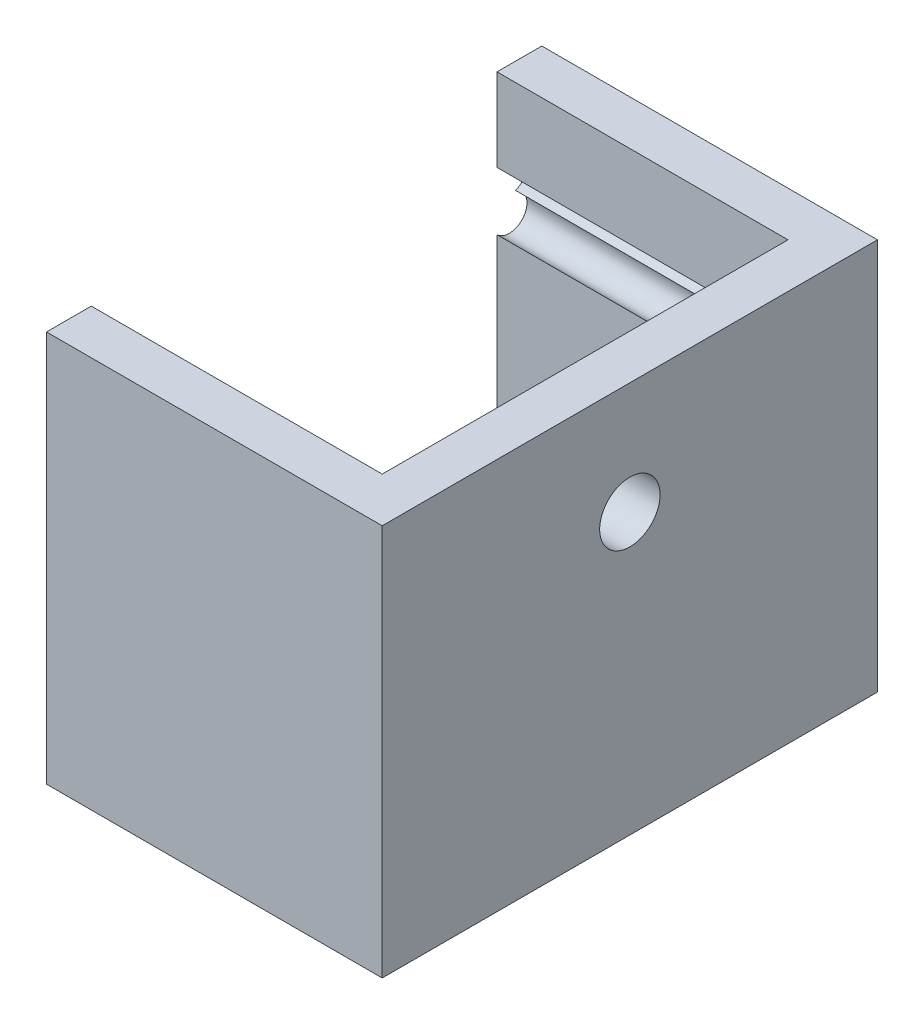
ISO-10303-21;
HEADER;
FILE_DESCRIPTION(('STEP AP214'),'2;1');
FILE_NAME('part.step','',(''),(''),'','','');
FILE_SCHEMA(('AUTOMOTIVE_DESIGN { 1 0 10303 214 1 1 1 1 }'));
ENDSEC;
DATA;
#1=APPLICATION_CONTEXT('core data for automotive mechanical design processes');
#2=APPLICATION_PROTOCOL_DEFINITION('international standard','automotive_design',2000,#1);
#3=PRODUCT_CONTEXT('',#1,'mechanical');
#4=PRODUCT('Part','Part','',(#3));
#5=PRODUCT_RELATED_PRODUCT_CATEGORY('part','',(#4));
#6=PRODUCT_DEFINITION_FORMATION('','',#4);
#7=PRODUCT_DEFINITION_CONTEXT('part definition',#1,'design');
#8=PRODUCT_DEFINITION('design','',#6,#7);
#9=PRODUCT_DEFINITION_SHAPE('','',#8);
#10=(LENGTH_UNIT() NAMED_UNIT(*) SI_UNIT(.MILLI.,.METRE.));
#11=(NAMED_UNIT(*) PLANE_ANGLE_UNIT() SI_UNIT($,.RADIAN.));
#12=(NAMED_UNIT(*) SI_UNIT($,.STERADIAN.) SOLID_ANGLE_UNIT());
#13=UNCERTAINTY_MEASURE_WITH_UNIT(LENGTH_MEASURE(1.E-05),#10,'distance_accuracy_value','');
#14=(GEOMETRIC_REPRESENTATION_CONTEXT(3) GLOBAL_UNCERTAINTY_ASSIGNED_CONTEXT((#13)) GLOBAL_UNIT_ASSIGNED_CONTEXT((#10,
#11,#12)) REPRESENTATION_CONTEXT('',''));
#15=CARTESIAN_POINT('',(0.,0.,0.));
#16=DIRECTION('',(0.,0.,1.));
#17=DIRECTION('',(1.,0.,0.));
#18=AXIS2_PLACEMENT_3D('',#15,#16,#17);
#19=CARTESIAN_POINT('',(-30.,4.,4.));
#20=DIRECTION('',(0.,0.,-1.));
#21=DIRECTION('',(-1.,0.,0.));
#22=AXIS2_PLACEMENT_3D('',#19,#20,#21);
#23=PLANE('',#22);
#24=DIRECTION('',(0.,1.,0.));
#25=VECTOR('',#24,1.);
#26=CARTESIAN_POINT('',(-30.,4.,4.));
#27=LINE('',#26,#25);
#28=CARTESIAN_POINT('',(-30.,27.6022200317595,4.));
#29=VERTEX_POINT('',#28);
#30=CARTESIAN_POINT('',(-30.,35.,4.));
#31=VERTEX_POINT('',#30);
#32=EDGE_CURVE('E166',#29,#31,#27,.T.);
#33=ORIENTED_EDGE('',*,*,#32,.F.);
#34=DIRECTION('',(-1.,0.,0.));
#35=VECTOR('',#34,1.);
#36=CARTESIAN_POINT('',(2.66075258510628,27.6022200317595,4.));
#37=LINE('',#36,#35);
#38=CARTESIAN_POINT('',(-4.00000000000001,27.6022200317595,4.));
#39=VERTEX_POINT('',#38);
#40=EDGE_CURVE('E154',#39,#29,#37,.T.);
#41=ORIENTED_EDGE('',*,*,#40,.F.);
#42=DIRECTION('',(0.,1.,0.));
#43=VECTOR('',#42,1.);
#44=CARTESIAN_POINT('',(-4.00000000000001,4.,4.));
#45=LINE('',#44,#43);
#46=CARTESIAN_POINT('',(-4.00000000000001,35.,4.));
#47=VERTEX_POINT('',#46);
#48=EDGE_CURVE('E164',#39,#47,#45,.T.);
#49=ORIENTED_EDGE('',*,*,#48,.T.);
#50=DIRECTION('',(-1.,0.,0.));
#51=VECTOR('',#50,1.);
#52=CARTESIAN_POINT('',(-30.,35.,4.));
#53=LINE('',#52,#51);
#54=EDGE_CURVE('E309',#47,#31,#53,.T.);
#55=ORIENTED_EDGE('',*,*,#54,.T.);
#56=EDGE_LOOP('',(#33,#41,#49,#55));
#57=FACE_BOUND('',#56,.T.);
#58=ADVANCED_FACE('F45',(#57),#23,.F.);
#59=CARTESIAN_POINT('',(-30.,4.,40.26));
#60=DIRECTION('',(0.,0.,1.));
#61=DIRECTION('',(1.,0.,0.));
#62=AXIS2_PLACEMENT_3D('',#59,#60,#61);
#63=PLANE('',#62);
#64=DIRECTION('',(0.,1.,0.));
#65=VECTOR('',#64,1.);
#66=CARTESIAN_POINT('',(-30.,4.,40.26));
#67=LINE('',#66,#65);
#68=CARTESIAN_POINT('',(-30.,4.,40.26));
#69=VERTEX_POINT('',#68);
#70=CARTESIAN_POINT('',(-30.,22.3977799682404,40.26));
#71=VERTEX_POINT('',#70);
#72=EDGE_CURVE('E188',#69,#71,#67,.T.);
#73=ORIENTED_EDGE('',*,*,#72,.T.);
#74=DIRECTION('',(-1.,0.,0.));
#75=VECTOR('',#74,1.);
#76=CARTESIAN_POINT('',(2.66075258510628,22.3977799682404,40.26));
#77=LINE('',#76,#75);
#78=CARTESIAN_POINT('',(-4.00000000000001,22.3977799682404,40.26));
#79=VERTEX_POINT('',#78);
#80=EDGE_CURVE('E320',#79,#71,#77,.T.);
#81=ORIENTED_EDGE('',*,*,#80,.F.);
#82=DIRECTION('',(0.,1.,0.));
#83=VECTOR('',#82,1.);
#84=CARTESIAN_POINT('',(-4.,4.,40.26));
#85=LINE('',#84,#83);
#86=CARTESIAN_POINT('',(-4.,4.,40.26));
#87=VERTEX_POINT('',#86);
#88=EDGE_CURVE('E176',#87,#79,#85,.T.);
#89=ORIENTED_EDGE('',*,*,#88,.F.);
#90=DIRECTION('',(1.,0.,0.));
#91=VECTOR('',#90,1.);
#92=CARTESIAN_POINT('',(-30.,4.,40.26));
#93=LINE('',#92,#91);
#94=EDGE_CURVE('E344',#69,#87,#93,.T.);
#95=ORIENTED_EDGE('',*,*,#94,.F.);
#96=EDGE_LOOP('',(#73,#81,#89,#95));
#97=FACE_BOUND('',#96,.T.);
#98=ADVANCED_FACE('F273',(#97),#63,.F.);
#99=CARTESIAN_POINT('',(0.,0.,44.26));
#100=DIRECTION('',(-1.,0.,0.));
#101=DIRECTION('',(0.,0.,1.));
#102=AXIS2_PLACEMENT_3D('',#99,#100,#101);
#103=PLANE('',#102);
#104=CARTESIAN_POINT('',(0.,25.,22.13));
#105=DIRECTION('',(-1.,0.,0.));
#106=DIRECTION('',(0.,0.,1.));
#107=AXIS2_PLACEMENT_3D('',#104,#105,#106);
#108=CIRCLE('',#107,2.7);
#109=CARTESIAN_POINT('',(0.,25.,24.83));
#110=VERTEX_POINT('',#109);
#111=EDGE_CURVE('E239',#110,#110,#108,.T.);
#112=ORIENTED_EDGE('',*,*,#111,.T.);
#113=EDGE_LOOP('',(#112));
#114=FACE_BOUND('',#113,.T.);
#115=DIRECTION('',(0.,1.,0.));
#116=VECTOR('',#115,1.);
#117=CARTESIAN_POINT('',(0.,0.,0.));
#118=LINE('',#117,#116);
#119=CARTESIAN_POINT('',(0.,0.,0.));
#120=VERTEX_POINT('',#119);
#121=CARTESIAN_POINT('',(0.,35.,0.));
#122=VERTEX_POINT('',#121);
#123=EDGE_CURVE('E181',#120,#122,#118,.T.);
#124=ORIENTED_EDGE('',*,*,#123,.T.);
#125=DIRECTION('',(0.,0.,-1.));
#126=VECTOR('',#125,1.);
#127=CARTESIAN_POINT('',(0.,35.,44.26));
#128=LINE('',#127,#126);
#129=CARTESIAN_POINT('',(0.,35.,44.26));
#130=VERTEX_POINT('',#129);
#131=EDGE_CURVE('E11',#130,#122,#128,.T.);
#132=ORIENTED_EDGE('',*,*,#131,.F.);
#133=DIRECTION('',(0.,1.,0.));
#134=VECTOR('',#133,1.);
#135=CARTESIAN_POINT('',(0.,0.,44.26));
#136=LINE('',#135,#134);
#137=CARTESIAN_POINT('',(0.,0.,44.26));
#138=VERTEX_POINT('',#137);
#139=EDGE_CURVE('E197',#138,#130,#136,.T.);
#140=ORIENTED_EDGE('',*,*,#139,.F.);
#141=DIRECTION('',(0.,0.,-1.));
#142=VECTOR('',#141,1.);
#143=CARTESIAN_POINT('',(0.,0.,44.26));
#144=LINE('',#143,#142);
#145=EDGE_CURVE('E211',#138,#120,#144,.T.);
#146=ORIENTED_EDGE('',*,*,#145,.T.);
#147=EDGE_LOOP('',(#124,#132,#140,#146));
#148=FACE_BOUND('',#147,.T.);
#149=ADVANCED_FACE('F47',(#114,#148),#103,.F.);
#150=CARTESIAN_POINT('',(0.,35.,44.26));
#151=DIRECTION('',(0.,-1.,0.));
#152=DIRECTION('',(0.,0.,-1.));
#153=AXIS2_PLACEMENT_3D('',#150,#151,#152);
#154=PLANE('',#153);
#155=DIRECTION('',(0.,0.,-1.));
#156=VECTOR('',#155,1.);
#157=CARTESIAN_POINT('',(-30.,35.,44.26));
#158=LINE('',#157,#156);
#159=CARTESIAN_POINT('',(-30.,35.,0.));
#160=VERTEX_POINT('',#159);
#161=EDGE_CURVE('E231',#31,#160,#158,.T.);
#162=ORIENTED_EDGE('',*,*,#161,.F.);
#163=ORIENTED_EDGE('',*,*,#54,.F.);
#164=DIRECTION('',(0.,0.,-1.));
#165=VECTOR('',#164,1.);
#166=CARTESIAN_POINT('',(-4.00000000000001,35.,4.));
#167=LINE('',#166,#165);
#168=CARTESIAN_POINT('',(-4.00000000000001,35.,40.26));
#169=VERTEX_POINT('',#168);
#170=EDGE_CURVE('E172',#169,#47,#167,.T.);
#171=ORIENTED_EDGE('',*,*,#170,.F.);
#172=DIRECTION('',(1.,0.,0.));
#173=VECTOR('',#172,1.);
#174=CARTESIAN_POINT('',(-30.,35.,40.26));
#175=LINE('',#174,#173);
#176=CARTESIAN_POINT('',(-30.,35.,40.26));
#177=VERTEX_POINT('',#176);
#178=EDGE_CURVE('E351',#177,#169,#175,.T.);
#179=ORIENTED_EDGE('',*,*,#178,.F.);
#180=CARTESIAN_POINT('',(-30.,35.,44.26));
#181=VERTEX_POINT('',#180);
#182=EDGE_CURVE('E55',#181,#177,#158,.T.);
#183=ORIENTED_EDGE('',*,*,#182,.F.);
#184=DIRECTION('',(-1.,0.,0.));
#185=VECTOR('',#184,1.);
#186=CARTESIAN_POINT('',(0.,35.,44.26));
#187=LINE('',#186,#185);
#188=EDGE_CURVE('E201',#130,#181,#187,.T.);
#189=ORIENTED_EDGE('',*,*,#188,.F.);
#190=ORIENTED_EDGE('',*,*,#131,.T.);
#191=DIRECTION('',(-1.,0.,0.));
#192=VECTOR('',#191,1.);
#193=CARTESIAN_POINT('',(0.,35.,0.));
#194=LINE('',#193,#192);
#195=EDGE_CURVE('E215',#122,#160,#194,.T.);
#196=ORIENTED_EDGE('',*,*,#195,.T.);
#197=EDGE_LOOP('',(#162,#163,#171,#179,#183,#189,#190,#196));
#198=FACE_BOUND('',#197,.T.);
#199=ADVANCED_FACE('F371',(#198),#154,.F.);
#200=CARTESIAN_POINT('',(-30.,0.,44.26));
#201=DIRECTION('',(1.,0.,0.));
#202=DIRECTION('',(0.,0.,-1.));
#203=AXIS2_PLACEMENT_3D('',#200,#201,#202);
#204=PLANE('',#203);
#205=CARTESIAN_POINT('',(-30.,23.525,2.9));
#206=DIRECTION('',(-1.,0.,0.));
#207=DIRECTION('',(0.,0.,1.));
#208=AXIS2_PLACEMENT_3D('',#205,#206,#207);
#209=CIRCLE('',#208,1.575);
#210=CARTESIAN_POINT('',(-30.,25.,2.34773194914063));
#211=VERTEX_POINT('',#210);
#212=CARTESIAN_POINT('',(-30.,22.3977799682404,4.));
#213=VERTEX_POINT('',#212);
#214=EDGE_CURVE('E313',#211,#213,#209,.T.);
#215=ORIENTED_EDGE('',*,*,#214,.F.);
#216=CARTESIAN_POINT('',(-30.,26.475,2.9));
#217=DIRECTION('',(-1.,0.,0.));
#218=DIRECTION('',(0.,0.,1.));
#219=AXIS2_PLACEMENT_3D('',#216,#217,#218);
#220=CIRCLE('',#219,1.575);
#221=EDGE_CURVE('E168',#29,#211,#220,.T.);
#222=ORIENTED_EDGE('',*,*,#221,.F.);
#223=ORIENTED_EDGE('',*,*,#32,.T.);
#224=ORIENTED_EDGE('',*,*,#161,.T.);
#225=DIRECTION('',(0.,-1.,0.));
#226=VECTOR('',#225,1.);
#227=CARTESIAN_POINT('',(-30.,0.,0.));
#228=LINE('',#227,#226);
#229=CARTESIAN_POINT('',(-30.,0.,0.));
#230=VERTEX_POINT('',#229);
#231=EDGE_CURVE('E219',#160,#230,#228,.T.);
#232=ORIENTED_EDGE('',*,*,#231,.T.);
#233=DIRECTION('',(0.,0.,-1.));
#234=VECTOR('',#233,1.);
#235=CARTESIAN_POINT('',(-30.,0.,44.26));
#236=LINE('',#235,#234);
#237=CARTESIAN_POINT('',(-30.,0.,44.26));
#238=VERTEX_POINT('',#237);
#239=EDGE_CURVE('E227',#238,#230,#236,.T.);
#240=ORIENTED_EDGE('',*,*,#239,.F.);
#241=DIRECTION('',(0.,-1.,0.));
#242=VECTOR('',#241,1.);
#243=CARTESIAN_POINT('',(-30.,0.,44.26));
#244=LINE('',#243,#242);
#245=EDGE_CURVE('E205',#181,#238,#244,.T.);
#246=ORIENTED_EDGE('',*,*,#245,.F.);
#247=ORIENTED_EDGE('',*,*,#182,.T.);
#248=CARTESIAN_POINT('',(-30.,27.6022200317596,40.26));
#249=VERTEX_POINT('',#248);
#250=EDGE_CURVE('E192',#249,#177,#67,.T.);
#251=ORIENTED_EDGE('',*,*,#250,.F.);
#252=CARTESIAN_POINT('',(-30.,26.475,41.36));
#253=DIRECTION('',(-1.,0.,0.));
#254=DIRECTION('',(0.,0.,-1.));
#255=AXIS2_PLACEMENT_3D('',#252,#253,#254);
#256=CIRCLE('',#255,1.575);
#257=CARTESIAN_POINT('',(-30.,25.,41.9122680508594));
#258=VERTEX_POINT('',#257);
#259=EDGE_CURVE('E71',#258,#249,#256,.T.);
#260=ORIENTED_EDGE('',*,*,#259,.F.);
#261=CARTESIAN_POINT('',(-30.,23.525,41.36));
#262=DIRECTION('',(-1.,0.,0.));
#263=DIRECTION('',(0.,0.,-1.));
#264=AXIS2_PLACEMENT_3D('',#261,#262,#263);
#265=CIRCLE('',#264,1.575);
#266=EDGE_CURVE('E323',#71,#258,#265,.T.);
#267=ORIENTED_EDGE('',*,*,#266,.F.);
#268=ORIENTED_EDGE('',*,*,#72,.F.);
#269=DIRECTION('',(0.,0.,1.));
#270=VECTOR('',#269,1.);
#271=CARTESIAN_POINT('',(-30.,4.,40.26));
#272=LINE('',#271,#270);
#273=CARTESIAN_POINT('',(-30.,4.,4.));
#274=VERTEX_POINT('',#273);
#275=EDGE_CURVE('E340',#274,#69,#272,.T.);
#276=ORIENTED_EDGE('',*,*,#275,.F.);
#277=EDGE_CURVE('E193',#274,#213,#27,.T.);
#278=ORIENTED_EDGE('',*,*,#277,.T.);
#279=EDGE_LOOP('',(#215,#222,#223,#224,#232,#240,#246,#247,#251,#260,#267,#268,#276,#278));
#280=FACE_BOUND('',#279,.T.);
#281=ADVANCED_FACE('F364',(#280),#204,.F.);
#282=CARTESIAN_POINT('',(0.,0.,44.26));
#283=DIRECTION('',(0.,1.,0.));
#284=DIRECTION('',(-1.,0.,0.));
#285=AXIS2_PLACEMENT_3D('',#282,#283,#284);
#286=PLANE('',#285);
#287=CARTESIAN_POINT('',(-24.,0.,14.26));
#288=DIRECTION('',(0.,1.,0.));
#289=DIRECTION('',(1.,0.,0.));
#290=AXIS2_PLACEMENT_3D('',#287,#288,#289);
#291=CIRCLE('',#290,1.65);
#292=CARTESIAN_POINT('',(-22.35,0.,14.26));
#293=VERTEX_POINT('',#292);
#294=EDGE_CURVE('E384',#293,#293,#291,.T.);
#295=ORIENTED_EDGE('',*,*,#294,.T.);
#296=EDGE_LOOP('',(#295));
#297=FACE_BOUND('',#296,.T.);
#298=CARTESIAN_POINT('',(-12.,0.,14.26));
#299=DIRECTION('',(0.,1.,0.));
#300=DIRECTION('',(1.,0.,0.));
#301=AXIS2_PLACEMENT_3D('',#298,#299,#300);
#302=CIRCLE('',#301,1.65);
#303=CARTESIAN_POINT('',(-10.35,0.,14.26));
#304=VERTEX_POINT('',#303);
#305=EDGE_CURVE('E388',#304,#304,#302,.T.);
#306=ORIENTED_EDGE('',*,*,#305,.T.);
#307=EDGE_LOOP('',(#306));
#308=FACE_BOUND('',#307,.T.);
#309=CARTESIAN_POINT('',(-12.,0.,34.26));
#310=DIRECTION('',(0.,1.,0.));
#311=DIRECTION('',(-1.,0.,0.));
#312=AXIS2_PLACEMENT_3D('',#309,#310,#311);
#313=CIRCLE('',#312,1.65);
#314=CARTESIAN_POINT('',(-13.65,0.,34.26));
#315=VERTEX_POINT('',#314);
#316=EDGE_CURVE('E383',#315,#315,#313,.T.);
#317=ORIENTED_EDGE('',*,*,#316,.T.);
#318=EDGE_LOOP('',(#317));
#319=FACE_BOUND('',#318,.T.);
#320=CARTESIAN_POINT('',(-24.,0.,34.26));
#321=DIRECTION('',(0.,1.,0.));
#322=DIRECTION('',(-1.,0.,0.));
#323=AXIS2_PLACEMENT_3D('',#320,#321,#322);
#324=CIRCLE('',#323,1.65);
#325=CARTESIAN_POINT('',(-25.65,0.,34.26));
#326=VERTEX_POINT('',#325);
#327=EDGE_CURVE('E245',#326,#326,#324,.T.);
#328=ORIENTED_EDGE('',*,*,#327,.T.);
#329=EDGE_LOOP('',(#328));
#330=FACE_BOUND('',#329,.T.);
#331=DIRECTION('',(1.,0.,0.));
#332=VECTOR('',#331,1.);
#333=CARTESIAN_POINT('',(0.,0.,0.));
#334=LINE('',#333,#332);
#335=EDGE_CURVE('E202',#230,#120,#334,.T.);
#336=ORIENTED_EDGE('',*,*,#335,.T.);
#337=ORIENTED_EDGE('',*,*,#145,.F.);
#338=DIRECTION('',(1.,0.,0.));
#339=VECTOR('',#338,1.);
#340=CARTESIAN_POINT('',(0.,0.,44.26));
#341=LINE('',#340,#339);
#342=EDGE_CURVE('E208',#238,#138,#341,.T.);
#343=ORIENTED_EDGE('',*,*,#342,.F.);
#344=ORIENTED_EDGE('',*,*,#239,.T.);
#345=EDGE_LOOP('',(#336,#337,#343,#344));
#346=FACE_BOUND('',#345,.T.);
#347=ADVANCED_FACE('F396',(#297,#308,#319,#330,#346),#286,.F.);
#348=CARTESIAN_POINT('',(0.,0.,44.26));
#349=DIRECTION('',(0.,0.,1.));
#350=DIRECTION('',(1.,0.,0.));
#351=AXIS2_PLACEMENT_3D('',#348,#349,#350);
#352=PLANE('',#351);
#353=ORIENTED_EDGE('',*,*,#139,.T.);
#354=ORIENTED_EDGE('',*,*,#188,.T.);
#355=ORIENTED_EDGE('',*,*,#245,.T.);
#356=ORIENTED_EDGE('',*,*,#342,.T.);
#357=EDGE_LOOP('',(#353,#354,#355,#356));
#358=FACE_BOUND('',#357,.T.);
#359=ADVANCED_FACE('F295',(#358),#352,.T.);
#360=CARTESIAN_POINT('',(0.,0.,0.));
#361=DIRECTION('',(0.,0.,1.));
#362=DIRECTION('',(1.,0.,0.));
#363=AXIS2_PLACEMENT_3D('',#360,#361,#362);
#364=PLANE('',#363);
#365=ORIENTED_EDGE('',*,*,#123,.F.);
#366=ORIENTED_EDGE('',*,*,#335,.F.);
#367=ORIENTED_EDGE('',*,*,#231,.F.);
#368=ORIENTED_EDGE('',*,*,#195,.F.);
#369=EDGE_LOOP('',(#365,#366,#367,#368));
#370=FACE_BOUND('',#369,.T.);
#371=ADVANCED_FACE('F285',(#370),#364,.F.);
#372=CARTESIAN_POINT('',(-4.00000000000001,4.,4.));
#373=VERTEX_POINT('',#372);
#374=CARTESIAN_POINT('',(-4.00000000000001,22.3977799682404,4.));
#375=VERTEX_POINT('',#374);
#376=EDGE_CURVE('E175',#373,#375,#45,.T.);
#377=ORIENTED_EDGE('',*,*,#376,.T.);
#378=DIRECTION('',(-1.,0.,0.));
#379=VECTOR('',#378,1.);
#380=CARTESIAN_POINT('',(2.66075258510628,22.3977799682404,4.));
#381=LINE('',#380,#379);
#382=EDGE_CURVE('E63',#375,#213,#381,.T.);
#383=ORIENTED_EDGE('',*,*,#382,.T.);
#384=ORIENTED_EDGE('',*,*,#277,.F.);
#385=DIRECTION('',(-1.,0.,0.));
#386=VECTOR('',#385,1.);
#387=CARTESIAN_POINT('',(-30.,4.,4.));
#388=LINE('',#387,#386);
#389=EDGE_CURVE('E300',#373,#274,#388,.T.);
#390=ORIENTED_EDGE('',*,*,#389,.F.);
#391=EDGE_LOOP('',(#377,#383,#384,#390));
#392=FACE_BOUND('',#391,.T.);
#393=ADVANCED_FACE('F275',(#392),#23,.F.);
#394=CARTESIAN_POINT('',(-4.00000000000001,4.,4.));
#395=DIRECTION('',(1.,0.,0.));
#396=DIRECTION('',(0.,1.,0.));
#397=AXIS2_PLACEMENT_3D('',#394,#395,#396);
#398=PLANE('',#397);
#399=CARTESIAN_POINT('',(-4.,25.,22.13));
#400=DIRECTION('',(1.,0.,0.));
#401=DIRECTION('',(0.,1.,0.));
#402=AXIS2_PLACEMENT_3D('',#399,#400,#401);
#403=CIRCLE('',#402,2.7);
#404=CARTESIAN_POINT('',(-4.,27.7,22.13));
#405=VERTEX_POINT('',#404);
#406=EDGE_CURVE('E235',#405,#405,#403,.T.);
#407=ORIENTED_EDGE('',*,*,#406,.T.);
#408=EDGE_LOOP('',(#407));
#409=FACE_BOUND('',#408,.T.);
#410=ORIENTED_EDGE('',*,*,#170,.T.);
#411=ORIENTED_EDGE('',*,*,#48,.F.);
#412=CARTESIAN_POINT('',(-4.00000000000001,26.475,2.9));
#413=DIRECTION('',(1.,0.,0.));
#414=DIRECTION('',(0.,1.,0.));
#415=AXIS2_PLACEMENT_3D('',#412,#413,#414);
#416=CIRCLE('',#415,1.575);
#417=CARTESIAN_POINT('',(-4.00000000000001,25.,2.34773194914063));
#418=VERTEX_POINT('',#417);
#419=EDGE_CURVE('E150',#39,#418,#416,.F.);
#420=ORIENTED_EDGE('',*,*,#419,.T.);
#421=CARTESIAN_POINT('',(-4.00000000000001,23.525,2.9));
#422=DIRECTION('',(1.,0.,0.));
#423=DIRECTION('',(0.,1.,0.));
#424=AXIS2_PLACEMENT_3D('',#421,#422,#423);
#425=CIRCLE('',#424,1.575);
#426=EDGE_CURVE('E304',#418,#375,#425,.F.);
#427=ORIENTED_EDGE('',*,*,#426,.T.);
#428=ORIENTED_EDGE('',*,*,#376,.F.);
#429=DIRECTION('',(0.,0.,-1.));
#430=VECTOR('',#429,1.);
#431=CARTESIAN_POINT('',(-4.00000000000001,4.,4.));
#432=LINE('',#431,#430);
#433=EDGE_CURVE('E303',#87,#373,#432,.T.);
#434=ORIENTED_EDGE('',*,*,#433,.F.);
#435=ORIENTED_EDGE('',*,*,#88,.T.);
#436=CARTESIAN_POINT('',(-4.,23.525,41.36));
#437=DIRECTION('',(1.,0.,0.));
#438=DIRECTION('',(0.,1.,0.));
#439=AXIS2_PLACEMENT_3D('',#436,#437,#438);
#440=CIRCLE('',#439,1.575);
#441=CARTESIAN_POINT('',(-4.,25.,41.9122680508594));
#442=VERTEX_POINT('',#441);
#443=EDGE_CURVE('E324',#79,#442,#440,.F.);
#444=ORIENTED_EDGE('',*,*,#443,.T.);
#445=CARTESIAN_POINT('',(-4.,26.475,41.36));
#446=DIRECTION('',(1.,0.,0.));
#447=DIRECTION('',(0.,1.,0.));
#448=AXIS2_PLACEMENT_3D('',#445,#446,#447);
#449=CIRCLE('',#448,1.575);
#450=CARTESIAN_POINT('',(-4.00000000000001,27.6022200317596,40.26));
#451=VERTEX_POINT('',#450);
#452=EDGE_CURVE('E319',#442,#451,#449,.F.);
#453=ORIENTED_EDGE('',*,*,#452,.T.);
#454=EDGE_CURVE('E183',#451,#169,#85,.T.);
#455=ORIENTED_EDGE('',*,*,#454,.T.);
#456=EDGE_LOOP('',(#410,#411,#420,#427,#428,#434,#435,#444,#453,#455));
#457=FACE_BOUND('',#456,.T.);
#458=ADVANCED_FACE('F170',(#409,#457),#398,.F.);
#459=ORIENTED_EDGE('',*,*,#454,.F.);
#460=DIRECTION('',(-1.,0.,0.));
#461=VECTOR('',#460,1.);
#462=CARTESIAN_POINT('',(2.66075258510628,27.6022200317596,40.26));
#463=LINE('',#462,#461);
#464=EDGE_CURVE('E316',#451,#249,#463,.T.);
#465=ORIENTED_EDGE('',*,*,#464,.T.);
#466=ORIENTED_EDGE('',*,*,#250,.T.);
#467=ORIENTED_EDGE('',*,*,#178,.T.);
#468=EDGE_LOOP('',(#459,#465,#466,#467));
#469=FACE_BOUND('',#468,.T.);
#470=ADVANCED_FACE('F282',(#469),#63,.F.);
#471=CARTESIAN_POINT('',(0.,4.,0.));
#472=DIRECTION('',(0.,-1.,0.));
#473=DIRECTION('',(1.,0.,0.));
#474=AXIS2_PLACEMENT_3D('',#471,#472,#473);
#475=PLANE('',#474);
#476=CARTESIAN_POINT('',(-24.,4.,14.26));
#477=DIRECTION('',(0.,-1.,0.));
#478=DIRECTION('',(1.,0.,0.));
#479=AXIS2_PLACEMENT_3D('',#476,#477,#478);
#480=CIRCLE('',#479,1.65);
#481=CARTESIAN_POINT('',(-22.35,4.,14.26));
#482=VERTEX_POINT('',#481);
#483=EDGE_CURVE('E49',#482,#482,#480,.T.);
#484=ORIENTED_EDGE('',*,*,#483,.T.);
#485=EDGE_LOOP('',(#484));
#486=FACE_BOUND('',#485,.T.);
#487=CARTESIAN_POINT('',(-12.,4.,14.26));
#488=DIRECTION('',(0.,-1.,0.));
#489=DIRECTION('',(1.,0.,0.));
#490=AXIS2_PLACEMENT_3D('',#487,#488,#489);
#491=CIRCLE('',#490,1.65);
#492=CARTESIAN_POINT('',(-10.35,4.,14.26));
#493=VERTEX_POINT('',#492);
#494=EDGE_CURVE('E248',#493,#493,#491,.T.);
#495=ORIENTED_EDGE('',*,*,#494,.T.);
#496=EDGE_LOOP('',(#495));
#497=FACE_BOUND('',#496,.T.);
#498=CARTESIAN_POINT('',(-12.,4.,34.26));
#499=DIRECTION('',(0.,-1.,0.));
#500=DIRECTION('',(1.,0.,0.));
#501=AXIS2_PLACEMENT_3D('',#498,#499,#500);
#502=CIRCLE('',#501,1.65);
#503=CARTESIAN_POINT('',(-10.35,4.,34.26));
#504=VERTEX_POINT('',#503);
#505=EDGE_CURVE('E244',#504,#504,#502,.T.);
#506=ORIENTED_EDGE('',*,*,#505,.T.);
#507=EDGE_LOOP('',(#506));
#508=FACE_BOUND('',#507,.T.);
#509=CARTESIAN_POINT('',(-24.,4.,34.26));
#510=DIRECTION('',(0.,-1.,0.));
#511=DIRECTION('',(1.,0.,0.));
#512=AXIS2_PLACEMENT_3D('',#509,#510,#511);
#513=CIRCLE('',#512,1.65);
#514=CARTESIAN_POINT('',(-22.35,4.,34.26));
#515=VERTEX_POINT('',#514);
#516=EDGE_CURVE('E240',#515,#515,#513,.T.);
#517=ORIENTED_EDGE('',*,*,#516,.T.);
#518=EDGE_LOOP('',(#517));
#519=FACE_BOUND('',#518,.T.);
#520=ORIENTED_EDGE('',*,*,#389,.T.);
#521=ORIENTED_EDGE('',*,*,#275,.T.);
#522=ORIENTED_EDGE('',*,*,#94,.T.);
#523=ORIENTED_EDGE('',*,*,#433,.T.);
#524=EDGE_LOOP('',(#520,#521,#522,#523));
#525=FACE_BOUND('',#524,.T.);
#526=ADVANCED_FACE('F257',(#486,#497,#508,#519,#525),#475,.F.);
#527=CARTESIAN_POINT('',(2.66075258510628,23.525,41.36));
#528=DIRECTION('',(-1.,0.,0.));
#529=DIRECTION('',(0.,0.,1.));
#530=AXIS2_PLACEMENT_3D('',#527,#528,#529);
#531=CYLINDRICAL_SURFACE('',#530,1.575);
#532=ORIENTED_EDGE('',*,*,#80,.T.);
#533=ORIENTED_EDGE('',*,*,#266,.T.);
#534=DIRECTION('',(-1.,0.,0.));
#535=VECTOR('',#534,1.);
#536=CARTESIAN_POINT('',(2.66075258510628,25.,41.9122680508594));
#537=LINE('',#536,#535);
#538=EDGE_CURVE('E325',#442,#258,#537,.T.);
#539=ORIENTED_EDGE('',*,*,#538,.F.);
#540=ORIENTED_EDGE('',*,*,#443,.F.);
#541=EDGE_LOOP('',(#532,#533,#539,#540));
#542=FACE_BOUND('',#541,.T.);
#543=ADVANCED_FACE('F407',(#542),#531,.F.);
#544=CARTESIAN_POINT('',(2.66075258510628,26.475,41.36));
#545=DIRECTION('',(-1.,0.,0.));
#546=DIRECTION('',(0.,0.,1.));
#547=AXIS2_PLACEMENT_3D('',#544,#545,#546);
#548=CYLINDRICAL_SURFACE('',#547,1.575);
#549=ORIENTED_EDGE('',*,*,#538,.T.);
#550=ORIENTED_EDGE('',*,*,#259,.T.);
#551=ORIENTED_EDGE('',*,*,#464,.F.);
#552=ORIENTED_EDGE('',*,*,#452,.F.);
#553=EDGE_LOOP('',(#549,#550,#551,#552));
#554=FACE_BOUND('',#553,.T.);
#555=ADVANCED_FACE('F416',(#554),#548,.F.);
#556=CARTESIAN_POINT('',(2.66075258510628,26.475,2.9));
#557=DIRECTION('',(-1.,0.,0.));
#558=DIRECTION('',(0.,0.,1.));
#559=AXIS2_PLACEMENT_3D('',#556,#557,#558);
#560=CYLINDRICAL_SURFACE('',#559,1.575);
#561=ORIENTED_EDGE('',*,*,#40,.T.);
#562=ORIENTED_EDGE('',*,*,#221,.T.);
#563=DIRECTION('',(-1.,0.,0.));
#564=VECTOR('',#563,1.);
#565=CARTESIAN_POINT('',(2.66075258510628,25.,2.34773194914063));
#566=LINE('',#565,#564);
#567=EDGE_CURVE('E156',#418,#211,#566,.T.);
#568=ORIENTED_EDGE('',*,*,#567,.F.);
#569=ORIENTED_EDGE('',*,*,#419,.F.);
#570=EDGE_LOOP('',(#561,#562,#568,#569));
#571=FACE_BOUND('',#570,.T.);
#572=ADVANCED_FACE('F152',(#571),#560,.F.);
#573=CARTESIAN_POINT('',(2.66075258510628,23.525,2.9));
#574=DIRECTION('',(-1.,0.,0.));
#575=DIRECTION('',(0.,0.,1.));
#576=AXIS2_PLACEMENT_3D('',#573,#574,#575);
#577=CYLINDRICAL_SURFACE('',#576,1.575);
#578=ORIENTED_EDGE('',*,*,#567,.T.);
#579=ORIENTED_EDGE('',*,*,#214,.T.);
#580=ORIENTED_EDGE('',*,*,#382,.F.);
#581=ORIENTED_EDGE('',*,*,#426,.F.);
#582=EDGE_LOOP('',(#578,#579,#580,#581));
#583=FACE_BOUND('',#582,.T.);
#584=ADVANCED_FACE('F423',(#583),#577,.F.);
#585=CARTESIAN_POINT('',(-30.,25.,22.13));
#586=DIRECTION('',(1.,0.,0.));
#587=DIRECTION('',(0.,0.,-1.));
#588=AXIS2_PLACEMENT_3D('',#585,#586,#587);
#589=CYLINDRICAL_SURFACE('',#588,2.7);
#590=ORIENTED_EDGE('',*,*,#406,.F.);
#591=EDGE_LOOP('',(#590));
#592=FACE_BOUND('',#591,.T.);
#593=ORIENTED_EDGE('',*,*,#111,.F.);
#594=EDGE_LOOP('',(#593));
#595=FACE_BOUND('',#594,.T.);
#596=ADVANCED_FACE('F459',(#592,#595),#589,.F.);
#597=CARTESIAN_POINT('',(-24.,0.,34.26));
#598=DIRECTION('',(0.,1.,0.));
#599=DIRECTION('',(-1.,0.,0.));
#600=AXIS2_PLACEMENT_3D('',#597,#598,#599);
#601=CYLINDRICAL_SURFACE('',#600,1.65);
#602=ORIENTED_EDGE('',*,*,#327,.F.);
#603=EDGE_LOOP('',(#602));
#604=FACE_BOUND('',#603,.T.);
#605=ORIENTED_EDGE('',*,*,#516,.F.);
#606=EDGE_LOOP('',(#605));
#607=FACE_BOUND('',#606,.T.);
#608=ADVANCED_FACE('F401',(#604,#607),#601,.F.);
#609=CARTESIAN_POINT('',(-12.,0.,34.26));
#610=DIRECTION('',(0.,1.,0.));
#611=DIRECTION('',(-1.,0.,0.));
#612=AXIS2_PLACEMENT_3D('',#609,#610,#611);
#613=CYLINDRICAL_SURFACE('',#612,1.65);
#614=ORIENTED_EDGE('',*,*,#316,.F.);
#615=EDGE_LOOP('',(#614));
#616=FACE_BOUND('',#615,.T.);
#617=ORIENTED_EDGE('',*,*,#505,.F.);
#618=EDGE_LOOP('',(#617));
#619=FACE_BOUND('',#618,.T.);
#620=ADVANCED_FACE('F267',(#616,#619),#613,.F.);
#621=CARTESIAN_POINT('',(-12.,0.,14.26));
#622=DIRECTION('',(0.,1.,0.));
#623=DIRECTION('',(-1.,0.,0.));
#624=AXIS2_PLACEMENT_3D('',#621,#622,#623);
#625=CYLINDRICAL_SURFACE('',#624,1.65);
#626=ORIENTED_EDGE('',*,*,#305,.F.);
#627=EDGE_LOOP('',(#626));
#628=FACE_BOUND('',#627,.T.);
#629=ORIENTED_EDGE('',*,*,#494,.F.);
#630=EDGE_LOOP('',(#629));
#631=FACE_BOUND('',#630,.T.);
#632=ADVANCED_FACE('F261',(#628,#631),#625,.F.);
#633=CARTESIAN_POINT('',(-24.,0.,14.26));
#634=DIRECTION('',(0.,1.,0.));
#635=DIRECTION('',(-1.,0.,0.));
#636=AXIS2_PLACEMENT_3D('',#633,#634,#635);
#637=CYLINDRICAL_SURFACE('',#636,1.65);
#638=ORIENTED_EDGE('',*,*,#294,.F.);
#639=EDGE_LOOP('',(#638));
#640=FACE_BOUND('',#639,.T.);
#641=ORIENTED_EDGE('',*,*,#483,.F.);
#642=EDGE_LOOP('',(#641));
#643=FACE_BOUND('',#642,.T.);
#644=ADVANCED_FACE('F259',(#640,#643),#637,.F.);
#645=CLOSED_SHELL('',(#58,#98,#149,#199,#281,#347,#359,#371,#393,#458,#470,#526,#543,#555,#572,
#584,#596,#608,#620,#632,#644));
#646=MANIFOLD_SOLID_BREP('B2',#645);
#647=ADVANCED_BREP_SHAPE_REPRESENTATION('',(#18,#646),#14);
#648=SHAPE_DEFINITION_REPRESENTATION(#9,#647);
ENDSEC;
END-ISO-10303-21;
